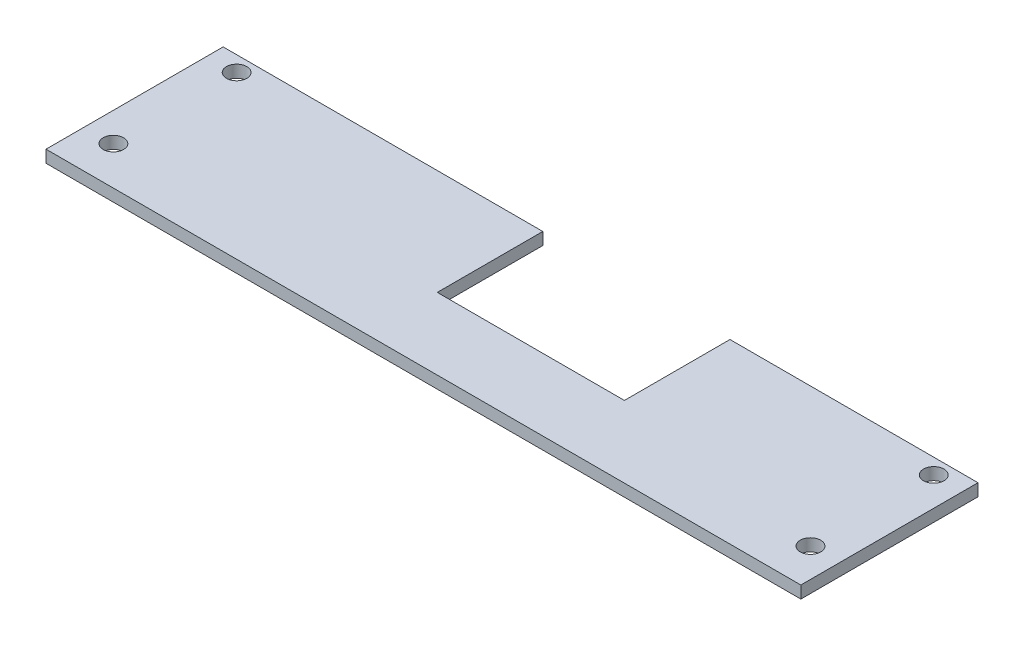
ISO-10303-21;
HEADER;
FILE_DESCRIPTION(('STEP AP214'),'2;1');
FILE_NAME('part.step','',(''),(''),'','','');
FILE_SCHEMA(('AUTOMOTIVE_DESIGN { 1 0 10303 214 1 1 1 1 }'));
ENDSEC;
DATA;
#1=APPLICATION_CONTEXT('core data for automotive mechanical design processes');
#2=APPLICATION_PROTOCOL_DEFINITION('international standard','automotive_design',2000,#1);
#3=PRODUCT_CONTEXT('',#1,'mechanical');
#4=PRODUCT('Part','Part','',(#3));
#5=PRODUCT_RELATED_PRODUCT_CATEGORY('part','',(#4));
#6=PRODUCT_DEFINITION_FORMATION('','',#4);
#7=PRODUCT_DEFINITION_CONTEXT('part definition',#1,'design');
#8=PRODUCT_DEFINITION('design','',#6,#7);
#9=PRODUCT_DEFINITION_SHAPE('','',#8);
#10=(LENGTH_UNIT() NAMED_UNIT(*) SI_UNIT(.MILLI.,.METRE.));
#11=(NAMED_UNIT(*) PLANE_ANGLE_UNIT() SI_UNIT($,.RADIAN.));
#12=(NAMED_UNIT(*) SI_UNIT($,.STERADIAN.) SOLID_ANGLE_UNIT());
#13=UNCERTAINTY_MEASURE_WITH_UNIT(LENGTH_MEASURE(1.E-05),#10,'distance_accuracy_value','');
#14=(GEOMETRIC_REPRESENTATION_CONTEXT(3) GLOBAL_UNCERTAINTY_ASSIGNED_CONTEXT((#13)) GLOBAL_UNIT_ASSIGNED_CONTEXT((#10,
#11,#12)) REPRESENTATION_CONTEXT('',''));
#15=CARTESIAN_POINT('',(0.,0.,0.));
#16=DIRECTION('',(0.,0.,1.));
#17=DIRECTION('',(1.,0.,0.));
#18=AXIS2_PLACEMENT_3D('',#15,#16,#17);
#19=CARTESIAN_POINT('',(0.,0.,0.));
#20=DIRECTION('',(0.,-1.,0.));
#21=DIRECTION('',(0.,0.,-1.));
#22=AXIS2_PLACEMENT_3D('',#19,#20,#21);
#23=PLANE('',#22);
#24=CARTESIAN_POINT('',(188.5,0.,-42.));
#25=DIRECTION('',(0.,1.,0.));
#26=DIRECTION('',(0.,0.,1.));
#27=AXIS2_PLACEMENT_3D('',#24,#25,#26);
#28=CIRCLE('',#27,2.65000000000001);
#29=CARTESIAN_POINT('',(188.5,0.,-39.35));
#30=VERTEX_POINT('',#29);
#31=EDGE_CURVE('E219',#30,#30,#28,.T.);
#32=ORIENTED_EDGE('',*,*,#31,.T.);
#33=EDGE_LOOP('',(#32));
#34=FACE_BOUND('',#33,.T.);
#35=DIRECTION('',(-1.,0.,0.));
#36=VECTOR('',#35,1.);
#37=CARTESIAN_POINT('',(0.,0.,-46.));
#38=LINE('',#37,#36);
#39=CARTESIAN_POINT('',(83.,0.,-46.));
#40=VERTEX_POINT('',#39);
#41=CARTESIAN_POINT('',(0.,0.,-46.));
#42=VERTEX_POINT('',#41);
#43=EDGE_CURVE('E117',#40,#42,#38,.T.);
#44=ORIENTED_EDGE('',*,*,#43,.F.);
#45=DIRECTION('',(0.,0.,-1.));
#46=VECTOR('',#45,1.);
#47=CARTESIAN_POINT('',(83.0000000000001,0.,-1.14977892277658E-13));
#48=LINE('',#47,#46);
#49=CARTESIAN_POINT('',(83.,0.,-18.5969351914537));
#50=VERTEX_POINT('',#49);
#51=EDGE_CURVE('E146',#50,#40,#48,.T.);
#52=ORIENTED_EDGE('',*,*,#51,.F.);
#53=DIRECTION('',(1.,0.,0.));
#54=VECTOR('',#53,1.);
#55=CARTESIAN_POINT('',(83.,0.,-18.5969351914537));
#56=LINE('',#55,#54);
#57=CARTESIAN_POINT('',(131.596040924094,0.,-18.5969351914537));
#58=VERTEX_POINT('',#57);
#59=EDGE_CURVE('E207',#50,#58,#56,.T.);
#60=ORIENTED_EDGE('',*,*,#59,.T.);
#61=DIRECTION('',(0.,0.,1.));
#62=VECTOR('',#61,1.);
#63=CARTESIAN_POINT('',(131.596040924094,0.,-46.));
#64=LINE('',#63,#62);
#65=CARTESIAN_POINT('',(131.596040924094,0.,-46.));
#66=VERTEX_POINT('',#65);
#67=EDGE_CURVE('E184',#66,#58,#64,.T.);
#68=ORIENTED_EDGE('',*,*,#67,.F.);
#69=CARTESIAN_POINT('',(196.,0.,-46.));
#70=VERTEX_POINT('',#69);
#71=EDGE_CURVE('E161',#70,#66,#38,.T.);
#72=ORIENTED_EDGE('',*,*,#71,.F.);
#73=DIRECTION('',(0.,0.,-1.));
#74=VECTOR('',#73,1.);
#75=CARTESIAN_POINT('',(196.,0.,0.));
#76=LINE('',#75,#74);
#77=CARTESIAN_POINT('',(196.,0.,0.));
#78=VERTEX_POINT('',#77);
#79=EDGE_CURVE('E162',#78,#70,#76,.T.);
#80=ORIENTED_EDGE('',*,*,#79,.F.);
#81=DIRECTION('',(1.,0.,0.));
#82=VECTOR('',#81,1.);
#83=CARTESIAN_POINT('',(0.,0.,0.));
#84=LINE('',#83,#82);
#85=CARTESIAN_POINT('',(0.,0.,0.));
#86=VERTEX_POINT('',#85);
#87=EDGE_CURVE('E166',#86,#78,#84,.T.);
#88=ORIENTED_EDGE('',*,*,#87,.F.);
#89=DIRECTION('',(0.,0.,1.));
#90=VECTOR('',#89,1.);
#91=CARTESIAN_POINT('',(0.,0.,0.));
#92=LINE('',#91,#90);
#93=EDGE_CURVE('E156',#42,#86,#92,.T.);
#94=ORIENTED_EDGE('',*,*,#93,.F.);
#95=EDGE_LOOP('',(#44,#52,#60,#68,#72,#80,#88,#94));
#96=FACE_BOUND('',#95,.T.);
#97=CARTESIAN_POINT('',(7.5,0.,-42.));
#98=DIRECTION('',(0.,1.,0.));
#99=DIRECTION('',(0.,0.,1.));
#100=AXIS2_PLACEMENT_3D('',#97,#98,#99);
#101=CIRCLE('',#100,2.65);
#102=CARTESIAN_POINT('',(7.5,0.,-39.35));
#103=VERTEX_POINT('',#102);
#104=EDGE_CURVE('E210',#103,#103,#101,.T.);
#105=ORIENTED_EDGE('',*,*,#104,.T.);
#106=EDGE_LOOP('',(#105));
#107=FACE_BOUND('',#106,.T.);
#108=CARTESIAN_POINT('',(7.5,0.,-10.));
#109=DIRECTION('',(0.,1.,0.));
#110=DIRECTION('',(0.,0.,1.));
#111=AXIS2_PLACEMENT_3D('',#108,#109,#110);
#112=CIRCLE('',#111,2.65);
#113=CARTESIAN_POINT('',(7.5,0.,-7.35));
#114=VERTEX_POINT('',#113);
#115=EDGE_CURVE('E225',#114,#114,#112,.T.);
#116=ORIENTED_EDGE('',*,*,#115,.T.);
#117=EDGE_LOOP('',(#116));
#118=FACE_BOUND('',#117,.T.);
#119=CARTESIAN_POINT('',(188.5,0.,-10.));
#120=DIRECTION('',(0.,1.,0.));
#121=DIRECTION('',(0.,0.,1.));
#122=AXIS2_PLACEMENT_3D('',#119,#120,#121);
#123=CIRCLE('',#122,2.65000000000001);
#124=CARTESIAN_POINT('',(188.5,0.,-7.34999999999999));
#125=VERTEX_POINT('',#124);
#126=EDGE_CURVE('E231',#125,#125,#123,.T.);
#127=ORIENTED_EDGE('',*,*,#126,.T.);
#128=EDGE_LOOP('',(#127));
#129=FACE_BOUND('',#128,.T.);
#130=ADVANCED_FACE('F71',(#34,#96,#107,#118,#129),#23,.T.);
#131=CARTESIAN_POINT('',(0.,3.175,-46.));
#132=DIRECTION('',(0.,0.,1.));
#133=DIRECTION('',(1.,0.,0.));
#134=AXIS2_PLACEMENT_3D('',#131,#132,#133);
#135=PLANE('',#134);
#136=DIRECTION('',(0.,1.,0.));
#137=VECTOR('',#136,1.);
#138=CARTESIAN_POINT('',(83.,0.,-46.));
#139=LINE('',#138,#137);
#140=CARTESIAN_POINT('',(83.,3.175,-46.));
#141=VERTEX_POINT('',#140);
#142=EDGE_CURVE('E148',#40,#141,#139,.T.);
#143=ORIENTED_EDGE('',*,*,#142,.F.);
#144=ORIENTED_EDGE('',*,*,#43,.T.);
#145=DIRECTION('',(0.,-1.,0.));
#146=VECTOR('',#145,1.);
#147=CARTESIAN_POINT('',(0.,3.175,-46.));
#148=LINE('',#147,#146);
#149=CARTESIAN_POINT('',(0.,3.175,-46.));
#150=VERTEX_POINT('',#149);
#151=EDGE_CURVE('E170',#150,#42,#148,.T.);
#152=ORIENTED_EDGE('',*,*,#151,.F.);
#153=DIRECTION('',(-1.,0.,0.));
#154=VECTOR('',#153,1.);
#155=CARTESIAN_POINT('',(0.,3.175,-46.));
#156=LINE('',#155,#154);
#157=EDGE_CURVE('E95',#141,#150,#156,.T.);
#158=ORIENTED_EDGE('',*,*,#157,.F.);
#159=EDGE_LOOP('',(#143,#144,#152,#158));
#160=FACE_BOUND('',#159,.T.);
#161=ADVANCED_FACE('F155',(#160),#135,.F.);
#162=DIRECTION('',(0.,1.,0.));
#163=VECTOR('',#162,1.);
#164=CARTESIAN_POINT('',(131.596040924094,0.,-46.));
#165=LINE('',#164,#163);
#166=CARTESIAN_POINT('',(131.596040924094,3.175,-46.));
#167=VERTEX_POINT('',#166);
#168=EDGE_CURVE('E189',#66,#167,#165,.T.);
#169=ORIENTED_EDGE('',*,*,#168,.T.);
#170=CARTESIAN_POINT('',(196.,3.175,-46.));
#171=VERTEX_POINT('',#170);
#172=EDGE_CURVE('E173',#171,#167,#156,.T.);
#173=ORIENTED_EDGE('',*,*,#172,.F.);
#174=DIRECTION('',(0.,-1.,0.));
#175=VECTOR('',#174,1.);
#176=CARTESIAN_POINT('',(196.,3.175,-46.));
#177=LINE('',#176,#175);
#178=EDGE_CURVE('E172',#171,#70,#177,.T.);
#179=ORIENTED_EDGE('',*,*,#178,.T.);
#180=ORIENTED_EDGE('',*,*,#71,.T.);
#181=EDGE_LOOP('',(#169,#173,#179,#180));
#182=FACE_BOUND('',#181,.T.);
#183=ADVANCED_FACE('F187',(#182),#135,.F.);
#184=CARTESIAN_POINT('',(0.,3.175,0.));
#185=DIRECTION('',(0.,-1.,0.));
#186=DIRECTION('',(0.,0.,-1.));
#187=AXIS2_PLACEMENT_3D('',#184,#185,#186);
#188=PLANE('',#187);
#189=CARTESIAN_POINT('',(188.5,3.175,-10.));
#190=DIRECTION('',(0.,1.,0.));
#191=DIRECTION('',(0.,0.,1.));
#192=AXIS2_PLACEMENT_3D('',#189,#190,#191);
#193=CIRCLE('',#192,2.65000000000001);
#194=CARTESIAN_POINT('',(188.5,3.175,-7.34999999999999));
#195=VERTEX_POINT('',#194);
#196=EDGE_CURVE('E234',#195,#195,#193,.T.);
#197=ORIENTED_EDGE('',*,*,#196,.F.);
#198=EDGE_LOOP('',(#197));
#199=FACE_BOUND('',#198,.T.);
#200=CARTESIAN_POINT('',(7.5,3.175,-10.));
#201=DIRECTION('',(0.,1.,0.));
#202=DIRECTION('',(0.,0.,1.));
#203=AXIS2_PLACEMENT_3D('',#200,#201,#202);
#204=CIRCLE('',#203,2.65);
#205=CARTESIAN_POINT('',(7.5,3.175,-7.35));
#206=VERTEX_POINT('',#205);
#207=EDGE_CURVE('E228',#206,#206,#204,.T.);
#208=ORIENTED_EDGE('',*,*,#207,.F.);
#209=EDGE_LOOP('',(#208));
#210=FACE_BOUND('',#209,.T.);
#211=CARTESIAN_POINT('',(188.5,3.175,-42.));
#212=DIRECTION('',(0.,1.,0.));
#213=DIRECTION('',(0.,0.,1.));
#214=AXIS2_PLACEMENT_3D('',#211,#212,#213);
#215=CIRCLE('',#214,2.65000000000001);
#216=CARTESIAN_POINT('',(188.5,3.175,-39.35));
#217=VERTEX_POINT('',#216);
#218=EDGE_CURVE('E222',#217,#217,#215,.T.);
#219=ORIENTED_EDGE('',*,*,#218,.F.);
#220=EDGE_LOOP('',(#219));
#221=FACE_BOUND('',#220,.T.);
#222=CARTESIAN_POINT('',(7.5,3.175,-42.));
#223=DIRECTION('',(0.,1.,0.));
#224=DIRECTION('',(0.,0.,1.));
#225=AXIS2_PLACEMENT_3D('',#222,#223,#224);
#226=CIRCLE('',#225,2.65);
#227=CARTESIAN_POINT('',(7.5,3.175,-39.35));
#228=VERTEX_POINT('',#227);
#229=EDGE_CURVE('E216',#228,#228,#226,.T.);
#230=ORIENTED_EDGE('',*,*,#229,.F.);
#231=EDGE_LOOP('',(#230));
#232=FACE_BOUND('',#231,.T.);
#233=DIRECTION('',(0.,0.,-1.));
#234=VECTOR('',#233,1.);
#235=CARTESIAN_POINT('',(83.0000000000001,3.175,-1.14977892277658E-13));
#236=LINE('',#235,#234);
#237=CARTESIAN_POINT('',(83.,3.175,-18.5969351914537));
#238=VERTEX_POINT('',#237);
#239=EDGE_CURVE('E153',#238,#141,#236,.T.);
#240=ORIENTED_EDGE('',*,*,#239,.T.);
#241=ORIENTED_EDGE('',*,*,#157,.T.);
#242=DIRECTION('',(0.,0.,1.));
#243=VECTOR('',#242,1.);
#244=CARTESIAN_POINT('',(0.,3.175,0.));
#245=LINE('',#244,#243);
#246=CARTESIAN_POINT('',(0.,3.175,0.));
#247=VERTEX_POINT('',#246);
#248=EDGE_CURVE('E165',#150,#247,#245,.T.);
#249=ORIENTED_EDGE('',*,*,#248,.T.);
#250=DIRECTION('',(1.,0.,0.));
#251=VECTOR('',#250,1.);
#252=CARTESIAN_POINT('',(0.,3.175,0.));
#253=LINE('',#252,#251);
#254=CARTESIAN_POINT('',(196.,3.175,0.));
#255=VERTEX_POINT('',#254);
#256=EDGE_CURVE('E124',#247,#255,#253,.T.);
#257=ORIENTED_EDGE('',*,*,#256,.T.);
#258=DIRECTION('',(0.,0.,-1.));
#259=VECTOR('',#258,1.);
#260=CARTESIAN_POINT('',(196.,3.175,0.));
#261=LINE('',#260,#259);
#262=EDGE_CURVE('E181',#255,#171,#261,.T.);
#263=ORIENTED_EDGE('',*,*,#262,.T.);
#264=ORIENTED_EDGE('',*,*,#172,.T.);
#265=DIRECTION('',(0.,0.,1.));
#266=VECTOR('',#265,1.);
#267=CARTESIAN_POINT('',(131.596040924094,3.175,-46.));
#268=LINE('',#267,#266);
#269=CARTESIAN_POINT('',(131.596040924094,3.175,-18.5969351914537));
#270=VERTEX_POINT('',#269);
#271=EDGE_CURVE('E205',#167,#270,#268,.T.);
#272=ORIENTED_EDGE('',*,*,#271,.T.);
#273=DIRECTION('',(1.,0.,0.));
#274=VECTOR('',#273,1.);
#275=CARTESIAN_POINT('',(83.,3.175,-18.5969351914537));
#276=LINE('',#275,#274);
#277=EDGE_CURVE('E208',#238,#270,#276,.T.);
#278=ORIENTED_EDGE('',*,*,#277,.F.);
#279=EDGE_LOOP('',(#240,#241,#249,#257,#263,#264,#272,#278));
#280=FACE_BOUND('',#279,.T.);
#281=ADVANCED_FACE('F240',(#199,#210,#221,#232,#280),#188,.F.);
#282=CARTESIAN_POINT('',(0.,3.175,0.));
#283=DIRECTION('',(1.,0.,0.));
#284=DIRECTION('',(0.,0.,-1.));
#285=AXIS2_PLACEMENT_3D('',#282,#283,#284);
#286=PLANE('',#285);
#287=ORIENTED_EDGE('',*,*,#93,.T.);
#288=DIRECTION('',(0.,-1.,0.));
#289=VECTOR('',#288,1.);
#290=CARTESIAN_POINT('',(0.,3.175,0.));
#291=LINE('',#290,#289);
#292=EDGE_CURVE('E12',#247,#86,#291,.T.);
#293=ORIENTED_EDGE('',*,*,#292,.F.);
#294=ORIENTED_EDGE('',*,*,#248,.F.);
#295=ORIENTED_EDGE('',*,*,#151,.T.);
#296=EDGE_LOOP('',(#287,#293,#294,#295));
#297=FACE_BOUND('',#296,.T.);
#298=ADVANCED_FACE('F73',(#297),#286,.F.);
#299=CARTESIAN_POINT('',(0.,3.175,0.));
#300=DIRECTION('',(0.,0.,-1.));
#301=DIRECTION('',(-1.,0.,0.));
#302=AXIS2_PLACEMENT_3D('',#299,#300,#301);
#303=PLANE('',#302);
#304=ORIENTED_EDGE('',*,*,#87,.T.);
#305=DIRECTION('',(0.,-1.,0.));
#306=VECTOR('',#305,1.);
#307=CARTESIAN_POINT('',(196.,3.175,0.));
#308=LINE('',#307,#306);
#309=EDGE_CURVE('E79',#255,#78,#308,.T.);
#310=ORIENTED_EDGE('',*,*,#309,.F.);
#311=ORIENTED_EDGE('',*,*,#256,.F.);
#312=ORIENTED_EDGE('',*,*,#292,.T.);
#313=EDGE_LOOP('',(#304,#310,#311,#312));
#314=FACE_BOUND('',#313,.T.);
#315=ADVANCED_FACE('F196',(#314),#303,.F.);
#316=CARTESIAN_POINT('',(196.,3.175,0.));
#317=DIRECTION('',(-1.,0.,0.));
#318=DIRECTION('',(0.,0.,1.));
#319=AXIS2_PLACEMENT_3D('',#316,#317,#318);
#320=PLANE('',#319);
#321=ORIENTED_EDGE('',*,*,#79,.T.);
#322=ORIENTED_EDGE('',*,*,#178,.F.);
#323=ORIENTED_EDGE('',*,*,#262,.F.);
#324=ORIENTED_EDGE('',*,*,#309,.T.);
#325=EDGE_LOOP('',(#321,#322,#323,#324));
#326=FACE_BOUND('',#325,.T.);
#327=ADVANCED_FACE('F179',(#326),#320,.F.);
#328=CARTESIAN_POINT('',(83.0000000000001,0.,-1.14977892277658E-13));
#329=DIRECTION('',(1.,0.,0.));
#330=DIRECTION('',(0.,0.,-1.));
#331=AXIS2_PLACEMENT_3D('',#328,#329,#330);
#332=PLANE('',#331);
#333=ORIENTED_EDGE('',*,*,#239,.F.);
#334=DIRECTION('',(0.,1.,0.));
#335=VECTOR('',#334,1.);
#336=CARTESIAN_POINT('',(83.,0.,-18.5969351914537));
#337=LINE('',#336,#335);
#338=EDGE_CURVE('E150',#50,#238,#337,.T.);
#339=ORIENTED_EDGE('',*,*,#338,.F.);
#340=ORIENTED_EDGE('',*,*,#51,.T.);
#341=ORIENTED_EDGE('',*,*,#142,.T.);
#342=EDGE_LOOP('',(#333,#339,#340,#341));
#343=FACE_BOUND('',#342,.T.);
#344=ADVANCED_FACE('F147',(#343),#332,.T.);
#345=CARTESIAN_POINT('',(131.596040924094,0.,-46.));
#346=DIRECTION('',(-1.,0.,0.));
#347=DIRECTION('',(0.,0.,1.));
#348=AXIS2_PLACEMENT_3D('',#345,#346,#347);
#349=PLANE('',#348);
#350=ORIENTED_EDGE('',*,*,#271,.F.);
#351=ORIENTED_EDGE('',*,*,#168,.F.);
#352=ORIENTED_EDGE('',*,*,#67,.T.);
#353=DIRECTION('',(0.,1.,0.));
#354=VECTOR('',#353,1.);
#355=CARTESIAN_POINT('',(131.596040924094,0.,-18.5969351914537));
#356=LINE('',#355,#354);
#357=EDGE_CURVE('E86',#58,#270,#356,.T.);
#358=ORIENTED_EDGE('',*,*,#357,.T.);
#359=EDGE_LOOP('',(#350,#351,#352,#358));
#360=FACE_BOUND('',#359,.T.);
#361=ADVANCED_FACE('F252',(#360),#349,.T.);
#362=CARTESIAN_POINT('',(83.,0.,-18.5969351914537));
#363=DIRECTION('',(0.,0.,1.));
#364=DIRECTION('',(1.,0.,0.));
#365=AXIS2_PLACEMENT_3D('',#362,#363,#364);
#366=PLANE('',#365);
#367=ORIENTED_EDGE('',*,*,#277,.T.);
#368=ORIENTED_EDGE('',*,*,#357,.F.);
#369=ORIENTED_EDGE('',*,*,#59,.F.);
#370=ORIENTED_EDGE('',*,*,#338,.T.);
#371=EDGE_LOOP('',(#367,#368,#369,#370));
#372=FACE_BOUND('',#371,.T.);
#373=ADVANCED_FACE('F250',(#372),#366,.F.);
#374=CARTESIAN_POINT('',(7.5,3.175,-42.));
#375=DIRECTION('',(0.,1.,0.));
#376=DIRECTION('',(0.,0.,1.));
#377=AXIS2_PLACEMENT_3D('',#374,#375,#376);
#378=CYLINDRICAL_SURFACE('',#377,2.65);
#379=ORIENTED_EDGE('',*,*,#104,.F.);
#380=EDGE_LOOP('',(#379));
#381=FACE_BOUND('',#380,.T.);
#382=ORIENTED_EDGE('',*,*,#229,.T.);
#383=EDGE_LOOP('',(#382));
#384=FACE_BOUND('',#383,.T.);
#385=ADVANCED_FACE('F259',(#381,#384),#378,.F.);
#386=CARTESIAN_POINT('',(188.5,3.175,-42.));
#387=DIRECTION('',(0.,1.,0.));
#388=DIRECTION('',(0.,0.,1.));
#389=AXIS2_PLACEMENT_3D('',#386,#387,#388);
#390=CYLINDRICAL_SURFACE('',#389,2.65000000000001);
#391=ORIENTED_EDGE('',*,*,#31,.F.);
#392=EDGE_LOOP('',(#391));
#393=FACE_BOUND('',#392,.T.);
#394=ORIENTED_EDGE('',*,*,#218,.T.);
#395=EDGE_LOOP('',(#394));
#396=FACE_BOUND('',#395,.T.);
#397=ADVANCED_FACE('F339',(#393,#396),#390,.F.);
#398=CARTESIAN_POINT('',(7.5,3.175,-10.));
#399=DIRECTION('',(0.,1.,0.));
#400=DIRECTION('',(0.,0.,1.));
#401=AXIS2_PLACEMENT_3D('',#398,#399,#400);
#402=CYLINDRICAL_SURFACE('',#401,2.65);
#403=ORIENTED_EDGE('',*,*,#115,.F.);
#404=EDGE_LOOP('',(#403));
#405=FACE_BOUND('',#404,.T.);
#406=ORIENTED_EDGE('',*,*,#207,.T.);
#407=EDGE_LOOP('',(#406));
#408=FACE_BOUND('',#407,.T.);
#409=ADVANCED_FACE('F349',(#405,#408),#402,.F.);
#410=CARTESIAN_POINT('',(188.5,3.175,-10.));
#411=DIRECTION('',(0.,1.,0.));
#412=DIRECTION('',(0.,0.,1.));
#413=AXIS2_PLACEMENT_3D('',#410,#411,#412);
#414=CYLINDRICAL_SURFACE('',#413,2.65000000000001);
#415=ORIENTED_EDGE('',*,*,#126,.F.);
#416=EDGE_LOOP('',(#415));
#417=FACE_BOUND('',#416,.T.);
#418=ORIENTED_EDGE('',*,*,#196,.T.);
#419=EDGE_LOOP('',(#418));
#420=FACE_BOUND('',#419,.T.);
#421=ADVANCED_FACE('F238',(#417,#420),#414,.F.);
#422=CLOSED_SHELL('',(#130,#161,#183,#281,#298,#315,#327,#344,#361,#373,#385,#397,#409,#421));
#423=MANIFOLD_SOLID_BREP('B2',#422);
#424=ADVANCED_BREP_SHAPE_REPRESENTATION('',(#18,#423),#14);
#425=SHAPE_DEFINITION_REPRESENTATION(#9,#424);
ENDSEC;
END-ISO-10303-21;
